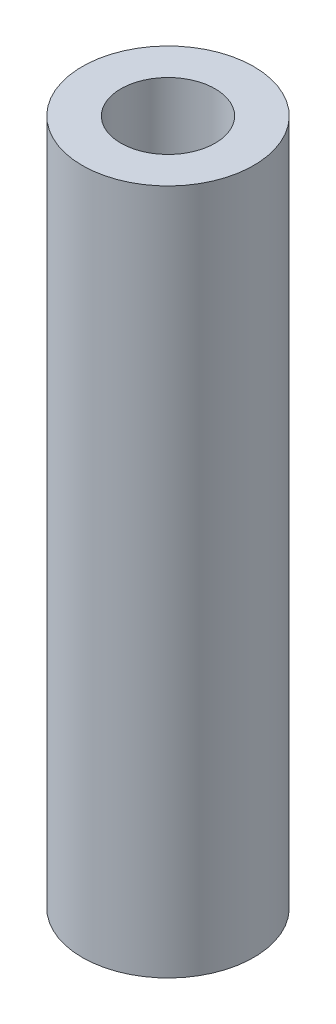
ISO-10303-21;
HEADER;
FILE_DESCRIPTION(('STEP AP214'),'2;1');
FILE_NAME('part.step','',(''),(''),'','','');
FILE_SCHEMA(('AUTOMOTIVE_DESIGN { 1 0 10303 214 1 1 1 1 }'));
ENDSEC;
DATA;
#1=APPLICATION_CONTEXT('core data for automotive mechanical design processes');
#2=APPLICATION_PROTOCOL_DEFINITION('international standard','automotive_design',2000,#1);
#3=PRODUCT_CONTEXT('',#1,'mechanical');
#4=PRODUCT('Part','Part','',(#3));
#5=PRODUCT_RELATED_PRODUCT_CATEGORY('part','',(#4));
#6=PRODUCT_DEFINITION_FORMATION('','',#4);
#7=PRODUCT_DEFINITION_CONTEXT('part definition',#1,'design');
#8=PRODUCT_DEFINITION('design','',#6,#7);
#9=PRODUCT_DEFINITION_SHAPE('','',#8);
#10=(LENGTH_UNIT() NAMED_UNIT(*) SI_UNIT(.MILLI.,.METRE.));
#11=(NAMED_UNIT(*) PLANE_ANGLE_UNIT() SI_UNIT($,.RADIAN.));
#12=(NAMED_UNIT(*) SI_UNIT($,.STERADIAN.) SOLID_ANGLE_UNIT());
#13=UNCERTAINTY_MEASURE_WITH_UNIT(LENGTH_MEASURE(1.E-05),#10,'distance_accuracy_value','');
#14=(GEOMETRIC_REPRESENTATION_CONTEXT(3) GLOBAL_UNCERTAINTY_ASSIGNED_CONTEXT((#13)) GLOBAL_UNIT_ASSIGNED_CONTEXT((#10,
#11,#12)) REPRESENTATION_CONTEXT('',''));
#15=CARTESIAN_POINT('',(0.,0.,0.));
#16=DIRECTION('',(0.,0.,1.));
#17=DIRECTION('',(1.,0.,0.));
#18=AXIS2_PLACEMENT_3D('',#15,#16,#17);
#19=CARTESIAN_POINT('',(0.,40.,0.));
#20=DIRECTION('',(0.,1.,0.));
#21=DIRECTION('',(0.,0.,1.));
#22=AXIS2_PLACEMENT_3D('',#19,#20,#21);
#23=PLANE('',#22);
#24=CARTESIAN_POINT('',(0.,40.,0.));
#25=DIRECTION('',(0.,1.,0.));
#26=DIRECTION('',(0.,0.,1.));
#27=AXIS2_PLACEMENT_3D('',#24,#25,#26);
#28=CIRCLE('',#27,5.);
#29=CARTESIAN_POINT('',(0.,40.,5.));
#30=VERTEX_POINT('',#29);
#31=EDGE_CURVE('E10',#30,#30,#28,.T.);
#32=ORIENTED_EDGE('',*,*,#31,.T.);
#33=EDGE_LOOP('',(#32));
#34=FACE_BOUND('',#33,.T.);
#35=CARTESIAN_POINT('',(0.,40.,0.));
#36=DIRECTION('',(0.,1.,0.));
#37=DIRECTION('',(0.,0.,1.));
#38=AXIS2_PLACEMENT_3D('',#35,#36,#37);
#39=CIRCLE('',#38,2.75);
#40=CARTESIAN_POINT('',(0.,40.,2.75));
#41=VERTEX_POINT('',#40);
#42=EDGE_CURVE('E48',#41,#41,#39,.T.);
#43=ORIENTED_EDGE('',*,*,#42,.F.);
#44=EDGE_LOOP('',(#43));
#45=FACE_BOUND('',#44,.T.);
#46=ADVANCED_FACE('F37',(#34,#45),#23,.T.);
#47=CARTESIAN_POINT('',(0.,0.,0.));
#48=DIRECTION('',(0.,1.,0.));
#49=DIRECTION('',(0.,0.,1.));
#50=AXIS2_PLACEMENT_3D('',#47,#48,#49);
#51=PLANE('',#50);
#52=CARTESIAN_POINT('',(0.,0.,0.));
#53=DIRECTION('',(0.,1.,0.));
#54=DIRECTION('',(0.,0.,1.));
#55=AXIS2_PLACEMENT_3D('',#52,#53,#54);
#56=CIRCLE('',#55,5.);
#57=CARTESIAN_POINT('',(0.,0.,5.));
#58=VERTEX_POINT('',#57);
#59=EDGE_CURVE('E41',#58,#58,#56,.T.);
#60=ORIENTED_EDGE('',*,*,#59,.F.);
#61=EDGE_LOOP('',(#60));
#62=FACE_BOUND('',#61,.T.);
#63=CARTESIAN_POINT('',(0.,0.,0.));
#64=DIRECTION('',(0.,1.,0.));
#65=DIRECTION('',(0.,0.,1.));
#66=AXIS2_PLACEMENT_3D('',#63,#64,#65);
#67=CIRCLE('',#66,2.75);
#68=CARTESIAN_POINT('',(0.,0.,2.75));
#69=VERTEX_POINT('',#68);
#70=EDGE_CURVE('E50',#69,#69,#67,.T.);
#71=ORIENTED_EDGE('',*,*,#70,.T.);
#72=EDGE_LOOP('',(#71));
#73=FACE_BOUND('',#72,.T.);
#74=ADVANCED_FACE('F60',(#62,#73),#51,.F.);
#75=CARTESIAN_POINT('',(0.,40.,0.));
#76=DIRECTION('',(0.,-1.,0.));
#77=DIRECTION('',(0.,0.,-1.));
#78=AXIS2_PLACEMENT_3D('',#75,#76,#77);
#79=CYLINDRICAL_SURFACE('',#78,5.);
#80=ORIENTED_EDGE('',*,*,#31,.F.);
#81=EDGE_LOOP('',(#80));
#82=FACE_BOUND('',#81,.T.);
#83=ORIENTED_EDGE('',*,*,#59,.T.);
#84=EDGE_LOOP('',(#83));
#85=FACE_BOUND('',#84,.T.);
#86=ADVANCED_FACE('F39',(#82,#85),#79,.T.);
#87=CARTESIAN_POINT('',(0.,40.,0.));
#88=DIRECTION('',(0.,-1.,0.));
#89=DIRECTION('',(0.,0.,-1.));
#90=AXIS2_PLACEMENT_3D('',#87,#88,#89);
#91=CYLINDRICAL_SURFACE('',#90,2.75);
#92=ORIENTED_EDGE('',*,*,#42,.T.);
#93=EDGE_LOOP('',(#92));
#94=FACE_BOUND('',#93,.T.);
#95=ORIENTED_EDGE('',*,*,#70,.F.);
#96=EDGE_LOOP('',(#95));
#97=FACE_BOUND('',#96,.T.);
#98=ADVANCED_FACE('F56',(#94,#97),#91,.F.);
#99=CLOSED_SHELL('',(#46,#74,#86,#98));
#100=MANIFOLD_SOLID_BREP('B2',#99);
#101=ADVANCED_BREP_SHAPE_REPRESENTATION('',(#18,#100),#14);
#102=SHAPE_DEFINITION_REPRESENTATION(#9,#101);
ENDSEC;
END-ISO-10303-21;
